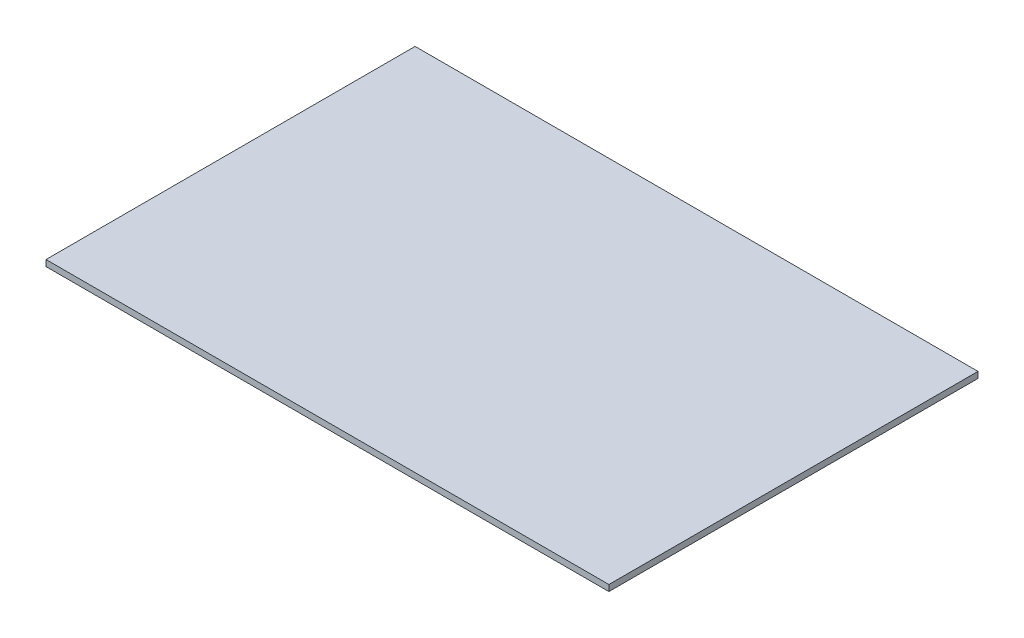
ISO-10303-21;
HEADER;
FILE_DESCRIPTION(('STEP AP214'),'2;1');
FILE_NAME('part.step','',(''),(''),'','','');
FILE_SCHEMA(('AUTOMOTIVE_DESIGN { 1 0 10303 214 1 1 1 1 }'));
ENDSEC;
DATA;
#1=APPLICATION_CONTEXT('core data for automotive mechanical design processes');
#2=APPLICATION_PROTOCOL_DEFINITION('international standard','automotive_design',2000,#1);
#3=PRODUCT_CONTEXT('',#1,'mechanical');
#4=PRODUCT('Part','Part','',(#3));
#5=PRODUCT_RELATED_PRODUCT_CATEGORY('part','',(#4));
#6=PRODUCT_DEFINITION_FORMATION('','',#4);
#7=PRODUCT_DEFINITION_CONTEXT('part definition',#1,'design');
#8=PRODUCT_DEFINITION('design','',#6,#7);
#9=PRODUCT_DEFINITION_SHAPE('','',#8);
#10=(LENGTH_UNIT() NAMED_UNIT(*) SI_UNIT(.MILLI.,.METRE.));
#11=(NAMED_UNIT(*) PLANE_ANGLE_UNIT() SI_UNIT($,.RADIAN.));
#12=(NAMED_UNIT(*) SI_UNIT($,.STERADIAN.) SOLID_ANGLE_UNIT());
#13=UNCERTAINTY_MEASURE_WITH_UNIT(LENGTH_MEASURE(1.E-05),#10,'distance_accuracy_value','');
#14=(GEOMETRIC_REPRESENTATION_CONTEXT(3) GLOBAL_UNCERTAINTY_ASSIGNED_CONTEXT((#13)) GLOBAL_UNIT_ASSIGNED_CONTEXT((#10,
#11,#12)) REPRESENTATION_CONTEXT('',''));
#15=CARTESIAN_POINT('',(0.,0.,0.));
#16=DIRECTION('',(0.,0.,1.));
#17=DIRECTION('',(1.,0.,0.));
#18=AXIS2_PLACEMENT_3D('',#15,#16,#17);
#19=CARTESIAN_POINT('',(0.,5.8,0.));
#20=DIRECTION('',(0.,-1.,0.));
#21=DIRECTION('',(0.,0.,-1.));
#22=AXIS2_PLACEMENT_3D('',#19,#20,#21);
#23=PLANE('',#22);
#24=DIRECTION('',(-1.,0.,0.));
#25=VECTOR('',#24,1.);
#26=CARTESIAN_POINT('',(924.4,5.8,30.));
#27=LINE('',#26,#25);
#28=CARTESIAN_POINT('',(924.4,5.8,30.));
#29=VERTEX_POINT('',#28);
#30=CARTESIAN_POINT('',(10.,5.8,30.));
#31=VERTEX_POINT('',#30);
#32=EDGE_CURVE('E150',#29,#31,#27,.T.);
#33=ORIENTED_EDGE('',*,*,#32,.F.);
#34=DIRECTION('',(0.,0.,1.));
#35=VECTOR('',#34,1.);
#36=CARTESIAN_POINT('',(924.4,5.8,-589.6));
#37=LINE('',#36,#35);
#38=CARTESIAN_POINT('',(924.4,5.8,-569.6));
#39=VERTEX_POINT('',#38);
#40=EDGE_CURVE('E12',#39,#29,#37,.T.);
#41=ORIENTED_EDGE('',*,*,#40,.F.);
#42=DIRECTION('',(1.,0.,0.));
#43=VECTOR('',#42,1.);
#44=CARTESIAN_POINT('',(10.,5.8,-569.6));
#45=LINE('',#44,#43);
#46=CARTESIAN_POINT('',(10.,5.8,-569.6));
#47=VERTEX_POINT('',#46);
#48=EDGE_CURVE('E158',#47,#39,#45,.T.);
#49=ORIENTED_EDGE('',*,*,#48,.F.);
#50=DIRECTION('',(0.,0.,-1.));
#51=VECTOR('',#50,1.);
#52=CARTESIAN_POINT('',(10.,5.8,20.));
#53=LINE('',#52,#51);
#54=EDGE_CURVE('E143',#31,#47,#53,.T.);
#55=ORIENTED_EDGE('',*,*,#54,.F.);
#56=EDGE_LOOP('',(#33,#41,#49,#55));
#57=FACE_BOUND('',#56,.T.);
#58=ADVANCED_FACE('F135',(#57),#23,.F.);
#59=CARTESIAN_POINT('',(924.4,0.,0.));
#60=DIRECTION('',(1.,0.,0.));
#61=DIRECTION('',(0.,0.,-1.));
#62=AXIS2_PLACEMENT_3D('',#59,#60,#61);
#63=PLANE('',#62);
#64=ORIENTED_EDGE('',*,*,#40,.T.);
#65=DIRECTION('',(0.,1.,0.));
#66=VECTOR('',#65,1.);
#67=CARTESIAN_POINT('',(924.4,0.,30.));
#68=LINE('',#67,#66);
#69=CARTESIAN_POINT('',(924.4,-4.2,30.));
#70=VERTEX_POINT('',#69);
#71=EDGE_CURVE('E183',#70,#29,#68,.T.);
#72=ORIENTED_EDGE('',*,*,#71,.F.);
#73=DIRECTION('',(0.,0.,-1.));
#74=VECTOR('',#73,1.);
#75=CARTESIAN_POINT('',(924.4,-4.2,30.));
#76=LINE('',#75,#74);
#77=CARTESIAN_POINT('',(924.4,-4.2,-569.6));
#78=VERTEX_POINT('',#77);
#79=EDGE_CURVE('E193',#70,#78,#76,.T.);
#80=ORIENTED_EDGE('',*,*,#79,.T.);
#81=DIRECTION('',(0.,-1.,0.));
#82=VECTOR('',#81,1.);
#83=CARTESIAN_POINT('',(924.4,5.8,-569.6));
#84=LINE('',#83,#82);
#85=EDGE_CURVE('E214',#39,#78,#84,.T.);
#86=ORIENTED_EDGE('',*,*,#85,.F.);
#87=EDGE_LOOP('',(#64,#72,#80,#86));
#88=FACE_BOUND('',#87,.T.);
#89=ADVANCED_FACE('F221',(#88),#63,.T.);
#90=CARTESIAN_POINT('',(10.,0.,0.));
#91=DIRECTION('',(-1.,0.,0.));
#92=DIRECTION('',(0.,0.,1.));
#93=AXIS2_PLACEMENT_3D('',#90,#91,#92);
#94=PLANE('',#93);
#95=DIRECTION('',(0.,1.,0.));
#96=VECTOR('',#95,1.);
#97=CARTESIAN_POINT('',(10.,0.,-569.6));
#98=LINE('',#97,#96);
#99=CARTESIAN_POINT('',(10.,-4.2,-569.6));
#100=VERTEX_POINT('',#99);
#101=EDGE_CURVE('E197',#100,#47,#98,.T.);
#102=ORIENTED_EDGE('',*,*,#101,.F.);
#103=DIRECTION('',(0.,0.,1.));
#104=VECTOR('',#103,1.);
#105=CARTESIAN_POINT('',(10.,-4.2,-569.6));
#106=LINE('',#105,#104);
#107=CARTESIAN_POINT('',(10.,-4.2,30.));
#108=VERTEX_POINT('',#107);
#109=EDGE_CURVE('E190',#100,#108,#106,.T.);
#110=ORIENTED_EDGE('',*,*,#109,.T.);
#111=DIRECTION('',(0.,-1.,0.));
#112=VECTOR('',#111,1.);
#113=CARTESIAN_POINT('',(10.,5.8,30.));
#114=LINE('',#113,#112);
#115=EDGE_CURVE('E175',#31,#108,#114,.T.);
#116=ORIENTED_EDGE('',*,*,#115,.F.);
#117=ORIENTED_EDGE('',*,*,#54,.T.);
#118=EDGE_LOOP('',(#102,#110,#116,#117));
#119=FACE_BOUND('',#118,.T.);
#120=ADVANCED_FACE('F196',(#119),#94,.T.);
#121=CARTESIAN_POINT('',(0.,0.,-569.6));
#122=DIRECTION('',(0.,0.,-1.));
#123=DIRECTION('',(-1.,0.,0.));
#124=AXIS2_PLACEMENT_3D('',#121,#122,#123);
#125=PLANE('',#124);
#126=ORIENTED_EDGE('',*,*,#85,.T.);
#127=DIRECTION('',(-1.,0.,0.));
#128=VECTOR('',#127,1.);
#129=CARTESIAN_POINT('',(924.4,-4.2,-569.6));
#130=LINE('',#129,#128);
#131=EDGE_CURVE('E203',#78,#100,#130,.T.);
#132=ORIENTED_EDGE('',*,*,#131,.T.);
#133=ORIENTED_EDGE('',*,*,#101,.T.);
#134=ORIENTED_EDGE('',*,*,#48,.T.);
#135=EDGE_LOOP('',(#126,#132,#133,#134));
#136=FACE_BOUND('',#135,.T.);
#137=ADVANCED_FACE('F218',(#136),#125,.T.);
#138=CARTESIAN_POINT('',(0.,0.,30.));
#139=DIRECTION('',(0.,0.,1.));
#140=DIRECTION('',(1.,0.,0.));
#141=AXIS2_PLACEMENT_3D('',#138,#139,#140);
#142=PLANE('',#141);
#143=ORIENTED_EDGE('',*,*,#32,.T.);
#144=ORIENTED_EDGE('',*,*,#115,.T.);
#145=DIRECTION('',(1.,0.,0.));
#146=VECTOR('',#145,1.);
#147=CARTESIAN_POINT('',(10.,-4.2,30.));
#148=LINE('',#147,#146);
#149=EDGE_CURVE('E178',#108,#70,#148,.T.);
#150=ORIENTED_EDGE('',*,*,#149,.T.);
#151=ORIENTED_EDGE('',*,*,#71,.T.);
#152=EDGE_LOOP('',(#143,#144,#150,#151));
#153=FACE_BOUND('',#152,.T.);
#154=ADVANCED_FACE('F177',(#153),#142,.T.);
#155=CARTESIAN_POINT('',(0.,-4.2,0.));
#156=DIRECTION('',(0.,1.,0.));
#157=DIRECTION('',(0.,0.,1.));
#158=AXIS2_PLACEMENT_3D('',#155,#156,#157);
#159=PLANE('',#158);
#160=ORIENTED_EDGE('',*,*,#109,.F.);
#161=ORIENTED_EDGE('',*,*,#131,.F.);
#162=ORIENTED_EDGE('',*,*,#79,.F.);
#163=ORIENTED_EDGE('',*,*,#149,.F.);
#164=EDGE_LOOP('',(#160,#161,#162,#163));
#165=FACE_BOUND('',#164,.T.);
#166=ADVANCED_FACE('F188',(#165),#159,.F.);
#167=CLOSED_SHELL('',(#58,#89,#120,#137,#154,#166));
#168=MANIFOLD_SOLID_BREP('B2',#167);
#169=ADVANCED_BREP_SHAPE_REPRESENTATION('',(#18,#168),#14);
#170=SHAPE_DEFINITION_REPRESENTATION(#9,#169);
ENDSEC;
END-ISO-10303-21;
